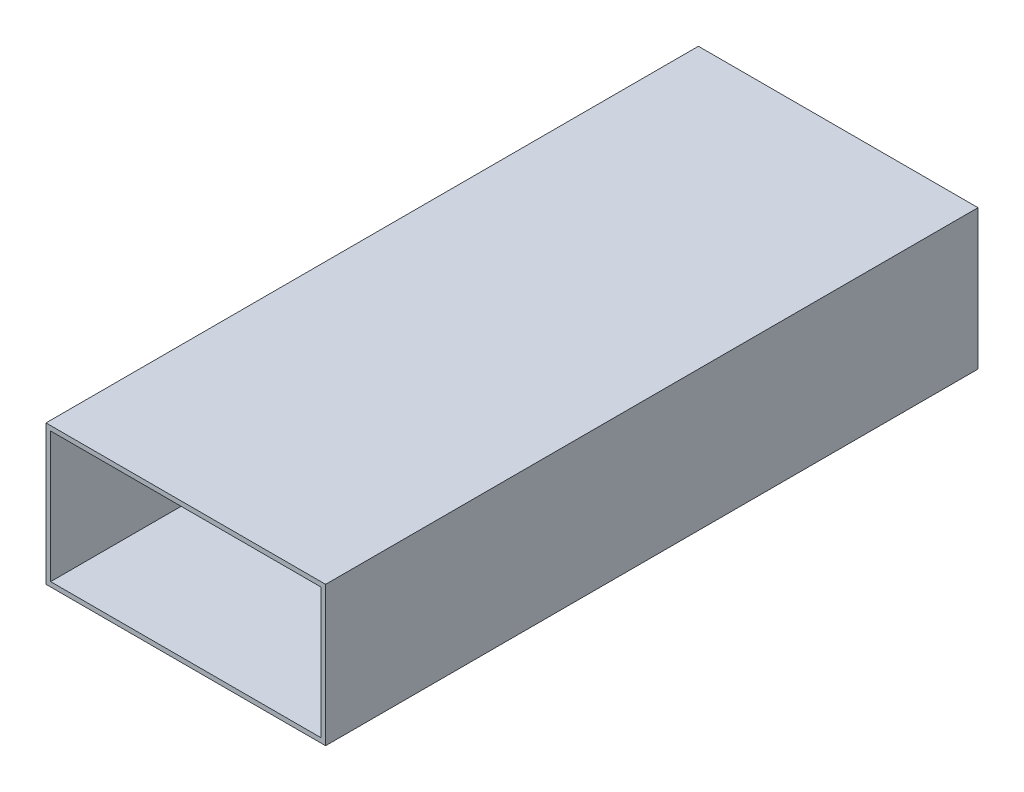
ISO-10303-21;
HEADER;
FILE_DESCRIPTION(('STEP AP214'),'2;1');
FILE_NAME('part.step','',(''),(''),'','','');
FILE_SCHEMA(('AUTOMOTIVE_DESIGN { 1 0 10303 214 1 1 1 1 }'));
ENDSEC;
DATA;
#1=APPLICATION_CONTEXT('core data for automotive mechanical design processes');
#2=APPLICATION_PROTOCOL_DEFINITION('international standard','automotive_design',2000,#1);
#3=PRODUCT_CONTEXT('',#1,'mechanical');
#4=PRODUCT('Part','Part','',(#3));
#5=PRODUCT_RELATED_PRODUCT_CATEGORY('part','',(#4));
#6=PRODUCT_DEFINITION_FORMATION('','',#4);
#7=PRODUCT_DEFINITION_CONTEXT('part definition',#1,'design');
#8=PRODUCT_DEFINITION('design','',#6,#7);
#9=PRODUCT_DEFINITION_SHAPE('','',#8);
#10=(LENGTH_UNIT() NAMED_UNIT(*) SI_UNIT(.MILLI.,.METRE.));
#11=(NAMED_UNIT(*) PLANE_ANGLE_UNIT() SI_UNIT($,.RADIAN.));
#12=(NAMED_UNIT(*) SI_UNIT($,.STERADIAN.) SOLID_ANGLE_UNIT());
#13=UNCERTAINTY_MEASURE_WITH_UNIT(LENGTH_MEASURE(1.E-05),#10,'distance_accuracy_value','');
#14=(GEOMETRIC_REPRESENTATION_CONTEXT(3) GLOBAL_UNCERTAINTY_ASSIGNED_CONTEXT((#13)) GLOBAL_UNIT_ASSIGNED_CONTEXT((#10,
#11,#12)) REPRESENTATION_CONTEXT('',''));
#15=CARTESIAN_POINT('',(0.,0.,0.));
#16=DIRECTION('',(0.,0.,1.));
#17=DIRECTION('',(1.,0.,0.));
#18=AXIS2_PLACEMENT_3D('',#15,#16,#17);
#19=CARTESIAN_POINT('',(0.,0.,140.));
#20=DIRECTION('',(0.,0.,-1.));
#21=DIRECTION('',(-1.,0.,0.));
#22=AXIS2_PLACEMENT_3D('',#19,#20,#21);
#23=PLANE('',#22);
#24=DIRECTION('',(0.,-1.,0.));
#25=VECTOR('',#24,1.);
#26=CARTESIAN_POINT('',(0.,0.,140.));
#27=LINE('',#26,#25);
#28=CARTESIAN_POINT('',(0.,30.,140.));
#29=VERTEX_POINT('',#28);
#30=CARTESIAN_POINT('',(0.,0.,140.));
#31=VERTEX_POINT('',#30);
#32=EDGE_CURVE('E136',#29,#31,#27,.T.);
#33=ORIENTED_EDGE('',*,*,#32,.T.);
#34=DIRECTION('',(1.,0.,0.));
#35=VECTOR('',#34,1.);
#36=CARTESIAN_POINT('',(0.,0.,140.));
#37=LINE('',#36,#35);
#38=CARTESIAN_POINT('',(60.,0.,140.));
#39=VERTEX_POINT('',#38);
#40=EDGE_CURVE('E139',#31,#39,#37,.T.);
#41=ORIENTED_EDGE('',*,*,#40,.T.);
#42=DIRECTION('',(0.,1.,0.));
#43=VECTOR('',#42,1.);
#44=CARTESIAN_POINT('',(60.,0.,140.));
#45=LINE('',#44,#43);
#46=CARTESIAN_POINT('',(60.,30.,140.));
#47=VERTEX_POINT('',#46);
#48=EDGE_CURVE('E142',#39,#47,#45,.T.);
#49=ORIENTED_EDGE('',*,*,#48,.T.);
#50=DIRECTION('',(-1.,0.,0.));
#51=VECTOR('',#50,1.);
#52=CARTESIAN_POINT('',(0.,30.,140.));
#53=LINE('',#52,#51);
#54=EDGE_CURVE('E144',#47,#29,#53,.T.);
#55=ORIENTED_EDGE('',*,*,#54,.T.);
#56=EDGE_LOOP('',(#33,#41,#49,#55));
#57=FACE_BOUND('',#56,.T.);
#58=DIRECTION('',(0.,-1.,0.));
#59=VECTOR('',#58,1.);
#60=CARTESIAN_POINT('',(1.,1.,140.));
#61=LINE('',#60,#59);
#62=CARTESIAN_POINT('',(1.,29.,140.));
#63=VERTEX_POINT('',#62);
#64=CARTESIAN_POINT('',(1.,1.,140.));
#65=VERTEX_POINT('',#64);
#66=EDGE_CURVE('E100',#63,#65,#61,.T.);
#67=ORIENTED_EDGE('',*,*,#66,.F.);
#68=DIRECTION('',(-1.,0.,0.));
#69=VECTOR('',#68,1.);
#70=CARTESIAN_POINT('',(1.,29.,140.));
#71=LINE('',#70,#69);
#72=CARTESIAN_POINT('',(59.,29.,140.));
#73=VERTEX_POINT('',#72);
#74=EDGE_CURVE('E122',#73,#63,#71,.T.);
#75=ORIENTED_EDGE('',*,*,#74,.F.);
#76=DIRECTION('',(0.,1.,0.));
#77=VECTOR('',#76,1.);
#78=CARTESIAN_POINT('',(59.,1.,140.));
#79=LINE('',#78,#77);
#80=CARTESIAN_POINT('',(59.,1.,140.));
#81=VERTEX_POINT('',#80);
#82=EDGE_CURVE('E120',#81,#73,#79,.T.);
#83=ORIENTED_EDGE('',*,*,#82,.F.);
#84=DIRECTION('',(1.,0.,0.));
#85=VECTOR('',#84,1.);
#86=CARTESIAN_POINT('',(1.,1.,140.));
#87=LINE('',#86,#85);
#88=EDGE_CURVE('E108',#65,#81,#87,.T.);
#89=ORIENTED_EDGE('',*,*,#88,.F.);
#90=EDGE_LOOP('',(#67,#75,#83,#89));
#91=FACE_BOUND('',#90,.T.);
#92=ADVANCED_FACE('F35',(#57,#91),#23,.F.);
#93=CARTESIAN_POINT('',(0.,0.,0.));
#94=DIRECTION('',(0.,0.,-1.));
#95=DIRECTION('',(-1.,0.,0.));
#96=AXIS2_PLACEMENT_3D('',#93,#94,#95);
#97=PLANE('',#96);
#98=DIRECTION('',(0.,-1.,0.));
#99=VECTOR('',#98,1.);
#100=CARTESIAN_POINT('',(0.,0.,0.));
#101=LINE('',#100,#99);
#102=CARTESIAN_POINT('',(0.,30.,0.));
#103=VERTEX_POINT('',#102);
#104=CARTESIAN_POINT('',(0.,0.,0.));
#105=VERTEX_POINT('',#104);
#106=EDGE_CURVE('E116',#103,#105,#101,.T.);
#107=ORIENTED_EDGE('',*,*,#106,.F.);
#108=DIRECTION('',(-1.,0.,0.));
#109=VECTOR('',#108,1.);
#110=CARTESIAN_POINT('',(0.,30.,0.));
#111=LINE('',#110,#109);
#112=CARTESIAN_POINT('',(60.,30.,0.));
#113=VERTEX_POINT('',#112);
#114=EDGE_CURVE('E140',#113,#103,#111,.T.);
#115=ORIENTED_EDGE('',*,*,#114,.F.);
#116=DIRECTION('',(0.,1.,0.));
#117=VECTOR('',#116,1.);
#118=CARTESIAN_POINT('',(60.,0.,0.));
#119=LINE('',#118,#117);
#120=CARTESIAN_POINT('',(60.,0.,0.));
#121=VERTEX_POINT('',#120);
#122=EDGE_CURVE('E151',#121,#113,#119,.T.);
#123=ORIENTED_EDGE('',*,*,#122,.F.);
#124=DIRECTION('',(1.,0.,0.));
#125=VECTOR('',#124,1.);
#126=CARTESIAN_POINT('',(0.,0.,0.));
#127=LINE('',#126,#125);
#128=EDGE_CURVE('E149',#105,#121,#127,.T.);
#129=ORIENTED_EDGE('',*,*,#128,.F.);
#130=EDGE_LOOP('',(#107,#115,#123,#129));
#131=FACE_BOUND('',#130,.T.);
#132=DIRECTION('',(-1.,0.,0.));
#133=VECTOR('',#132,1.);
#134=CARTESIAN_POINT('',(1.,29.,0.));
#135=LINE('',#134,#133);
#136=CARTESIAN_POINT('',(59.,29.,0.));
#137=VERTEX_POINT('',#136);
#138=CARTESIAN_POINT('',(1.,29.,0.));
#139=VERTEX_POINT('',#138);
#140=EDGE_CURVE('E109',#137,#139,#135,.T.);
#141=ORIENTED_EDGE('',*,*,#140,.T.);
#142=DIRECTION('',(0.,-1.,0.));
#143=VECTOR('',#142,1.);
#144=CARTESIAN_POINT('',(1.,1.,0.));
#145=LINE('',#144,#143);
#146=CARTESIAN_POINT('',(1.,1.,0.));
#147=VERTEX_POINT('',#146);
#148=EDGE_CURVE('E58',#139,#147,#145,.T.);
#149=ORIENTED_EDGE('',*,*,#148,.T.);
#150=DIRECTION('',(1.,0.,0.));
#151=VECTOR('',#150,1.);
#152=CARTESIAN_POINT('',(1.,1.,0.));
#153=LINE('',#152,#151);
#154=CARTESIAN_POINT('',(59.,1.,0.));
#155=VERTEX_POINT('',#154);
#156=EDGE_CURVE('E115',#147,#155,#153,.T.);
#157=ORIENTED_EDGE('',*,*,#156,.T.);
#158=DIRECTION('',(0.,1.,0.));
#159=VECTOR('',#158,1.);
#160=CARTESIAN_POINT('',(59.,1.,0.));
#161=LINE('',#160,#159);
#162=EDGE_CURVE('E128',#155,#137,#161,.T.);
#163=ORIENTED_EDGE('',*,*,#162,.T.);
#164=EDGE_LOOP('',(#141,#149,#157,#163));
#165=FACE_BOUND('',#164,.T.);
#166=ADVANCED_FACE('F169',(#131,#165),#97,.T.);
#167=CARTESIAN_POINT('',(0.,0.,140.));
#168=DIRECTION('',(1.,0.,0.));
#169=DIRECTION('',(0.,0.,-1.));
#170=AXIS2_PLACEMENT_3D('',#167,#168,#169);
#171=PLANE('',#170);
#172=ORIENTED_EDGE('',*,*,#106,.T.);
#173=DIRECTION('',(0.,0.,-1.));
#174=VECTOR('',#173,1.);
#175=CARTESIAN_POINT('',(0.,0.,140.));
#176=LINE('',#175,#174);
#177=EDGE_CURVE('E11',#31,#105,#176,.T.);
#178=ORIENTED_EDGE('',*,*,#177,.F.);
#179=ORIENTED_EDGE('',*,*,#32,.F.);
#180=DIRECTION('',(0.,0.,-1.));
#181=VECTOR('',#180,1.);
#182=CARTESIAN_POINT('',(0.,30.,140.));
#183=LINE('',#182,#181);
#184=EDGE_CURVE('E146',#29,#103,#183,.T.);
#185=ORIENTED_EDGE('',*,*,#184,.T.);
#186=EDGE_LOOP('',(#172,#178,#179,#185));
#187=FACE_BOUND('',#186,.T.);
#188=ADVANCED_FACE('F37',(#187),#171,.F.);
#189=CARTESIAN_POINT('',(0.,0.,140.));
#190=DIRECTION('',(0.,1.,0.));
#191=DIRECTION('',(0.,0.,1.));
#192=AXIS2_PLACEMENT_3D('',#189,#190,#191);
#193=PLANE('',#192);
#194=ORIENTED_EDGE('',*,*,#128,.T.);
#195=DIRECTION('',(0.,0.,-1.));
#196=VECTOR('',#195,1.);
#197=CARTESIAN_POINT('',(60.,0.,140.));
#198=LINE('',#197,#196);
#199=EDGE_CURVE('E43',#39,#121,#198,.T.);
#200=ORIENTED_EDGE('',*,*,#199,.F.);
#201=ORIENTED_EDGE('',*,*,#40,.F.);
#202=ORIENTED_EDGE('',*,*,#177,.T.);
#203=EDGE_LOOP('',(#194,#200,#201,#202));
#204=FACE_BOUND('',#203,.T.);
#205=ADVANCED_FACE('F179',(#204),#193,.F.);
#206=CARTESIAN_POINT('',(60.,0.,140.));
#207=DIRECTION('',(-1.,0.,0.));
#208=DIRECTION('',(0.,0.,1.));
#209=AXIS2_PLACEMENT_3D('',#206,#207,#208);
#210=PLANE('',#209);
#211=ORIENTED_EDGE('',*,*,#122,.T.);
#212=DIRECTION('',(0.,0.,-1.));
#213=VECTOR('',#212,1.);
#214=CARTESIAN_POINT('',(60.,30.,140.));
#215=LINE('',#214,#213);
#216=EDGE_CURVE('E156',#47,#113,#215,.T.);
#217=ORIENTED_EDGE('',*,*,#216,.F.);
#218=ORIENTED_EDGE('',*,*,#48,.F.);
#219=ORIENTED_EDGE('',*,*,#199,.T.);
#220=EDGE_LOOP('',(#211,#217,#218,#219));
#221=FACE_BOUND('',#220,.T.);
#222=ADVANCED_FACE('F163',(#221),#210,.F.);
#223=CARTESIAN_POINT('',(0.,30.,140.));
#224=DIRECTION('',(0.,-1.,0.));
#225=DIRECTION('',(0.,0.,-1.));
#226=AXIS2_PLACEMENT_3D('',#223,#224,#225);
#227=PLANE('',#226);
#228=ORIENTED_EDGE('',*,*,#114,.T.);
#229=ORIENTED_EDGE('',*,*,#184,.F.);
#230=ORIENTED_EDGE('',*,*,#54,.F.);
#231=ORIENTED_EDGE('',*,*,#216,.T.);
#232=EDGE_LOOP('',(#228,#229,#230,#231));
#233=FACE_BOUND('',#232,.T.);
#234=ADVANCED_FACE('F173',(#233),#227,.F.);
#235=CARTESIAN_POINT('',(1.,1.,140.));
#236=DIRECTION('',(1.,0.,0.));
#237=DIRECTION('',(0.,0.,-1.));
#238=AXIS2_PLACEMENT_3D('',#235,#236,#237);
#239=PLANE('',#238);
#240=ORIENTED_EDGE('',*,*,#148,.F.);
#241=DIRECTION('',(0.,0.,-1.));
#242=VECTOR('',#241,1.);
#243=CARTESIAN_POINT('',(1.,29.,140.));
#244=LINE('',#243,#242);
#245=EDGE_CURVE('E104',#63,#139,#244,.T.);
#246=ORIENTED_EDGE('',*,*,#245,.F.);
#247=ORIENTED_EDGE('',*,*,#66,.T.);
#248=DIRECTION('',(0.,0.,-1.));
#249=VECTOR('',#248,1.);
#250=CARTESIAN_POINT('',(1.,1.,140.));
#251=LINE('',#250,#249);
#252=EDGE_CURVE('E103',#65,#147,#251,.T.);
#253=ORIENTED_EDGE('',*,*,#252,.T.);
#254=EDGE_LOOP('',(#240,#246,#247,#253));
#255=FACE_BOUND('',#254,.T.);
#256=ADVANCED_FACE('F102',(#255),#239,.T.);
#257=CARTESIAN_POINT('',(1.,1.,140.));
#258=DIRECTION('',(0.,1.,0.));
#259=DIRECTION('',(0.,0.,1.));
#260=AXIS2_PLACEMENT_3D('',#257,#258,#259);
#261=PLANE('',#260);
#262=ORIENTED_EDGE('',*,*,#156,.F.);
#263=ORIENTED_EDGE('',*,*,#252,.F.);
#264=ORIENTED_EDGE('',*,*,#88,.T.);
#265=DIRECTION('',(0.,0.,-1.));
#266=VECTOR('',#265,1.);
#267=CARTESIAN_POINT('',(59.,1.,140.));
#268=LINE('',#267,#266);
#269=EDGE_CURVE('E117',#81,#155,#268,.T.);
#270=ORIENTED_EDGE('',*,*,#269,.T.);
#271=EDGE_LOOP('',(#262,#263,#264,#270));
#272=FACE_BOUND('',#271,.T.);
#273=ADVANCED_FACE('F112',(#272),#261,.T.);
#274=CARTESIAN_POINT('',(59.,1.,140.));
#275=DIRECTION('',(-1.,0.,0.));
#276=DIRECTION('',(0.,0.,1.));
#277=AXIS2_PLACEMENT_3D('',#274,#275,#276);
#278=PLANE('',#277);
#279=ORIENTED_EDGE('',*,*,#162,.F.);
#280=ORIENTED_EDGE('',*,*,#269,.F.);
#281=ORIENTED_EDGE('',*,*,#82,.T.);
#282=DIRECTION('',(0.,0.,-1.));
#283=VECTOR('',#282,1.);
#284=CARTESIAN_POINT('',(59.,29.,140.));
#285=LINE('',#284,#283);
#286=EDGE_CURVE('E50',#73,#137,#285,.T.);
#287=ORIENTED_EDGE('',*,*,#286,.T.);
#288=EDGE_LOOP('',(#279,#280,#281,#287));
#289=FACE_BOUND('',#288,.T.);
#290=ADVANCED_FACE('F202',(#289),#278,.T.);
#291=CARTESIAN_POINT('',(1.,29.,140.));
#292=DIRECTION('',(0.,-1.,0.));
#293=DIRECTION('',(0.,0.,-1.));
#294=AXIS2_PLACEMENT_3D('',#291,#292,#293);
#295=PLANE('',#294);
#296=ORIENTED_EDGE('',*,*,#140,.F.);
#297=ORIENTED_EDGE('',*,*,#286,.F.);
#298=ORIENTED_EDGE('',*,*,#74,.T.);
#299=ORIENTED_EDGE('',*,*,#245,.T.);
#300=EDGE_LOOP('',(#296,#297,#298,#299));
#301=FACE_BOUND('',#300,.T.);
#302=ADVANCED_FACE('F206',(#301),#295,.T.);
#303=CLOSED_SHELL('',(#92,#166,#188,#205,#222,#234,#256,#273,#290,#302));
#304=MANIFOLD_SOLID_BREP('B2',#303);
#305=ADVANCED_BREP_SHAPE_REPRESENTATION('',(#18,#304),#14);
#306=SHAPE_DEFINITION_REPRESENTATION(#9,#305);
ENDSEC;
END-ISO-10303-21;
